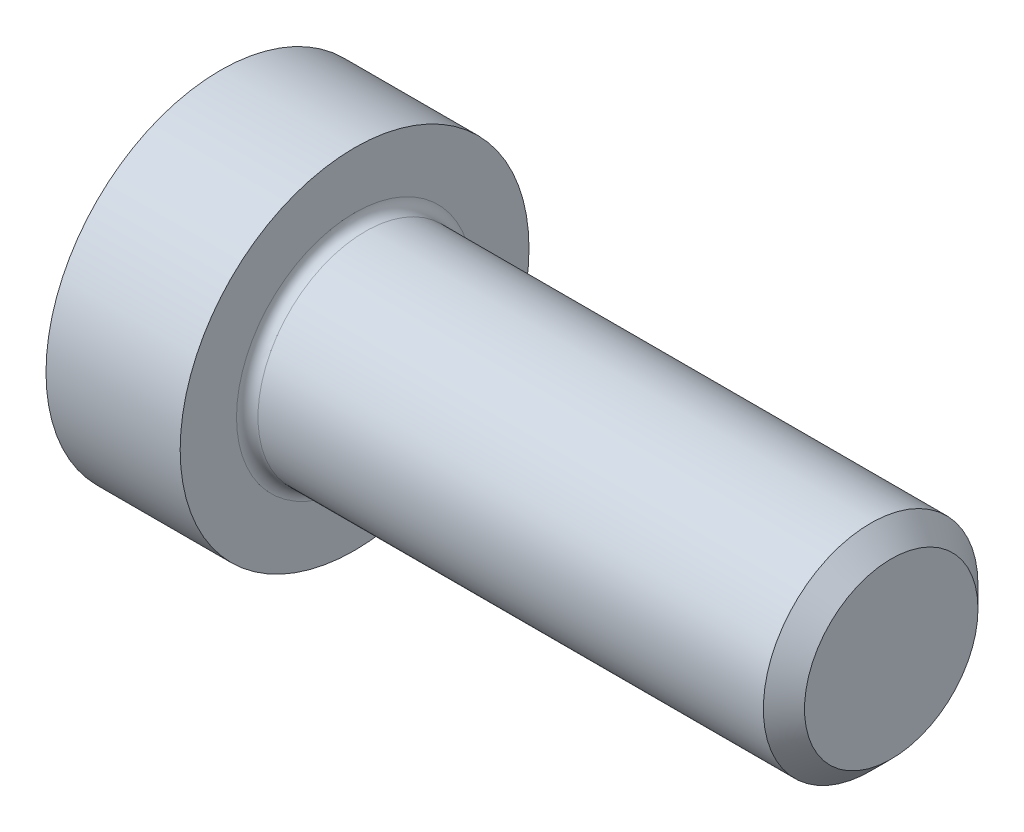
ISO-10303-21;
HEADER;
FILE_DESCRIPTION(('STEP AP214'),'2;1');
FILE_NAME('part.step','',(''),(''),'','','');
FILE_SCHEMA(('AUTOMOTIVE_DESIGN { 1 0 10303 214 1 1 1 1 }'));
ENDSEC;
DATA;
#1=APPLICATION_CONTEXT('core data for automotive mechanical design processes');
#2=APPLICATION_PROTOCOL_DEFINITION('international standard','automotive_design',2000,#1);
#3=PRODUCT_CONTEXT('',#1,'mechanical');
#4=PRODUCT('Part','Part','',(#3));
#5=PRODUCT_RELATED_PRODUCT_CATEGORY('part','',(#4));
#6=PRODUCT_DEFINITION_FORMATION('','',#4);
#7=PRODUCT_DEFINITION_CONTEXT('part definition',#1,'design');
#8=PRODUCT_DEFINITION('design','',#6,#7);
#9=PRODUCT_DEFINITION_SHAPE('','',#8);
#10=(LENGTH_UNIT() NAMED_UNIT(*) SI_UNIT(.MILLI.,.METRE.));
#11=(NAMED_UNIT(*) PLANE_ANGLE_UNIT() SI_UNIT($,.RADIAN.));
#12=(NAMED_UNIT(*) SI_UNIT($,.STERADIAN.) SOLID_ANGLE_UNIT());
#13=UNCERTAINTY_MEASURE_WITH_UNIT(LENGTH_MEASURE(1.E-05),#10,'distance_accuracy_value','');
#14=(GEOMETRIC_REPRESENTATION_CONTEXT(3) GLOBAL_UNCERTAINTY_ASSIGNED_CONTEXT((#13)) GLOBAL_UNIT_ASSIGNED_CONTEXT((#10,
#11,#12)) REPRESENTATION_CONTEXT('',''));
#15=CARTESIAN_POINT('',(0.,0.,0.));
#16=DIRECTION('',(0.,0.,1.));
#17=DIRECTION('',(1.,0.,0.));
#18=AXIS2_PLACEMENT_3D('',#15,#16,#17);
#19=CARTESIAN_POINT('',(-5.,0.,0.));
#20=DIRECTION('',(1.,0.,0.));
#21=DIRECTION('',(0.,0.,-1.));
#22=AXIS2_PLACEMENT_3D('',#19,#20,#21);
#23=PLANE('',#22);
#24=CARTESIAN_POINT('',(-5.,0.,0.));
#25=DIRECTION('',(1.,0.,0.));
#26=DIRECTION('',(0.,0.,-1.));
#27=AXIS2_PLACEMENT_3D('',#24,#25,#26);
#28=CIRCLE('',#27,6.5);
#29=CARTESIAN_POINT('',(-5.,0.,-6.5));
#30=VERTEX_POINT('',#29);
#31=EDGE_CURVE('E11',#30,#30,#28,.T.);
#32=ORIENTED_EDGE('',*,*,#31,.F.);
#33=EDGE_LOOP('',(#32));
#34=FACE_BOUND('',#33,.T.);
#35=DIRECTION('',(0.,0.5,-0.866025403784439));
#36=VECTOR('',#35,1.);
#37=CARTESIAN_POINT('',(-5.,-2.88675134594813,0.));
#38=LINE('',#37,#36);
#39=CARTESIAN_POINT('',(-5.,-2.88675134594813,0.));
#40=VERTEX_POINT('',#39);
#41=CARTESIAN_POINT('',(-5.,-1.44337567297406,-2.5));
#42=VERTEX_POINT('',#41);
#43=EDGE_CURVE('E152',#40,#42,#38,.T.);
#44=ORIENTED_EDGE('',*,*,#43,.T.);
#45=DIRECTION('',(0.,1.,0.));
#46=VECTOR('',#45,1.);
#47=CARTESIAN_POINT('',(-5.,-1.44337567297406,-2.5));
#48=LINE('',#47,#46);
#49=CARTESIAN_POINT('',(-5.,1.44337567297406,-2.5));
#50=VERTEX_POINT('',#49);
#51=EDGE_CURVE('E154',#42,#50,#48,.T.);
#52=ORIENTED_EDGE('',*,*,#51,.T.);
#53=DIRECTION('',(0.,0.5,0.866025403784439));
#54=VECTOR('',#53,1.);
#55=CARTESIAN_POINT('',(-5.,1.44337567297406,-2.5));
#56=LINE('',#55,#54);
#57=CARTESIAN_POINT('',(-5.,2.88675134594813,0.));
#58=VERTEX_POINT('',#57);
#59=EDGE_CURVE('E157',#50,#58,#56,.T.);
#60=ORIENTED_EDGE('',*,*,#59,.T.);
#61=DIRECTION('',(0.,-0.5,0.866025403784439));
#62=VECTOR('',#61,1.);
#63=CARTESIAN_POINT('',(-5.,2.88675134594813,0.));
#64=LINE('',#63,#62);
#65=CARTESIAN_POINT('',(-5.,1.44337567297406,2.5));
#66=VERTEX_POINT('',#65);
#67=EDGE_CURVE('E99',#58,#66,#64,.T.);
#68=ORIENTED_EDGE('',*,*,#67,.T.);
#69=DIRECTION('',(0.,-1.,0.));
#70=VECTOR('',#69,1.);
#71=CARTESIAN_POINT('',(-5.,1.44337567297406,2.5));
#72=LINE('',#71,#70);
#73=CARTESIAN_POINT('',(-5.,-1.44337567297406,2.5));
#74=VERTEX_POINT('',#73);
#75=EDGE_CURVE('E159',#66,#74,#72,.T.);
#76=ORIENTED_EDGE('',*,*,#75,.T.);
#77=DIRECTION('',(0.,-0.5,-0.866025403784439));
#78=VECTOR('',#77,1.);
#79=CARTESIAN_POINT('',(-5.,-1.44337567297406,2.5));
#80=LINE('',#79,#78);
#81=EDGE_CURVE('E114',#74,#40,#80,.T.);
#82=ORIENTED_EDGE('',*,*,#81,.T.);
#83=EDGE_LOOP('',(#44,#52,#60,#68,#76,#82));
#84=FACE_BOUND('',#83,.T.);
#85=ADVANCED_FACE('F16',(#34,#84),#23,.F.);
#86=CARTESIAN_POINT('',(20.,0.,0.));
#87=DIRECTION('',(1.,0.,0.));
#88=DIRECTION('',(0.,0.,-1.));
#89=AXIS2_PLACEMENT_3D('',#86,#87,#88);
#90=CYLINDRICAL_SURFACE('',#89,6.5);
#91=CARTESIAN_POINT('',(0.,0.,0.));
#92=DIRECTION('',(1.,0.,0.));
#93=DIRECTION('',(0.,0.,-1.));
#94=AXIS2_PLACEMENT_3D('',#91,#92,#93);
#95=CIRCLE('',#94,6.5);
#96=CARTESIAN_POINT('',(0.,0.,-6.5));
#97=VERTEX_POINT('',#96);
#98=EDGE_CURVE('E23',#97,#97,#95,.T.);
#99=ORIENTED_EDGE('',*,*,#98,.F.);
#100=EDGE_LOOP('',(#99));
#101=FACE_BOUND('',#100,.T.);
#102=ORIENTED_EDGE('',*,*,#31,.T.);
#103=EDGE_LOOP('',(#102));
#104=FACE_BOUND('',#103,.T.);
#105=ADVANCED_FACE('F143',(#101,#104),#90,.T.);
#106=CARTESIAN_POINT('',(0.,6.5,0.));
#107=DIRECTION('',(-1.,0.,0.));
#108=DIRECTION('',(0.,0.,1.));
#109=AXIS2_PLACEMENT_3D('',#106,#107,#108);
#110=PLANE('',#109);
#111=CARTESIAN_POINT('',(0.,0.,0.));
#112=DIRECTION('',(1.,0.,0.));
#113=DIRECTION('',(0.,0.,-1.));
#114=AXIS2_PLACEMENT_3D('',#111,#112,#113);
#115=CIRCLE('',#114,4.4);
#116=CARTESIAN_POINT('',(0.,0.,-4.4));
#117=VERTEX_POINT('',#116);
#118=EDGE_CURVE('E136',#117,#117,#115,.T.);
#119=ORIENTED_EDGE('',*,*,#118,.F.);
#120=EDGE_LOOP('',(#119));
#121=FACE_BOUND('',#120,.T.);
#122=ORIENTED_EDGE('',*,*,#98,.T.);
#123=EDGE_LOOP('',(#122));
#124=FACE_BOUND('',#123,.T.);
#125=ADVANCED_FACE('F141',(#121,#124),#110,.F.);
#126=CARTESIAN_POINT('',(0.399999999999999,0.,0.));
#127=DIRECTION('',(1.,0.,0.));
#128=DIRECTION('',(0.,0.,-1.));
#129=AXIS2_PLACEMENT_3D('',#126,#127,#128);
#130=TOROIDAL_SURFACE('',#129,4.4,0.399999999999999);
#131=CARTESIAN_POINT('',(0.400000000000001,0.,0.));
#132=DIRECTION('',(1.,0.,0.));
#133=DIRECTION('',(0.,0.,-1.));
#134=AXIS2_PLACEMENT_3D('',#131,#132,#133);
#135=CIRCLE('',#134,4.);
#136=CARTESIAN_POINT('',(0.400000000000001,0.,-4.));
#137=VERTEX_POINT('',#136);
#138=EDGE_CURVE('E133',#137,#137,#135,.T.);
#139=ORIENTED_EDGE('',*,*,#138,.F.);
#140=EDGE_LOOP('',(#139));
#141=FACE_BOUND('',#140,.T.);
#142=ORIENTED_EDGE('',*,*,#118,.T.);
#143=EDGE_LOOP('',(#142));
#144=FACE_BOUND('',#143,.T.);
#145=ADVANCED_FACE('F250',(#141,#144),#130,.F.);
#146=CARTESIAN_POINT('',(20.,0.,0.));
#147=DIRECTION('',(1.,0.,0.));
#148=DIRECTION('',(0.,0.,-1.));
#149=AXIS2_PLACEMENT_3D('',#146,#147,#148);
#150=CYLINDRICAL_SURFACE('',#149,4.);
#151=CARTESIAN_POINT('',(19.233,0.,0.));
#152=DIRECTION('',(1.,0.,0.));
#153=DIRECTION('',(0.,0.,-1.));
#154=AXIS2_PLACEMENT_3D('',#151,#152,#153);
#155=CIRCLE('',#154,4.);
#156=CARTESIAN_POINT('',(19.233,0.,-4.));
#157=VERTEX_POINT('',#156);
#158=EDGE_CURVE('E130',#157,#157,#155,.T.);
#159=ORIENTED_EDGE('',*,*,#158,.F.);
#160=EDGE_LOOP('',(#159));
#161=FACE_BOUND('',#160,.T.);
#162=ORIENTED_EDGE('',*,*,#138,.T.);
#163=EDGE_LOOP('',(#162));
#164=FACE_BOUND('',#163,.T.);
#165=ADVANCED_FACE('F246',(#161,#164),#150,.T.);
#166=CARTESIAN_POINT('',(19.233,0.,0.));
#167=DIRECTION('',(-1.,0.,0.));
#168=DIRECTION('',(0.,0.,1.));
#169=AXIS2_PLACEMENT_3D('',#166,#167,#168);
#170=CONICAL_SURFACE('',#169,4.,0.785398163397448);
#171=CARTESIAN_POINT('',(20.,0.,0.));
#172=DIRECTION('',(1.,0.,0.));
#173=DIRECTION('',(0.,0.,-1.));
#174=AXIS2_PLACEMENT_3D('',#171,#172,#173);
#175=CIRCLE('',#174,3.233);
#176=CARTESIAN_POINT('',(20.,0.,-3.233));
#177=VERTEX_POINT('',#176);
#178=EDGE_CURVE('E126',#177,#177,#175,.T.);
#179=ORIENTED_EDGE('',*,*,#178,.F.);
#180=EDGE_LOOP('',(#179));
#181=FACE_BOUND('',#180,.T.);
#182=ORIENTED_EDGE('',*,*,#158,.T.);
#183=EDGE_LOOP('',(#182));
#184=FACE_BOUND('',#183,.T.);
#185=ADVANCED_FACE('F242',(#181,#184),#170,.T.);
#186=CARTESIAN_POINT('',(20.,3.233,0.));
#187=DIRECTION('',(-1.,0.,0.));
#188=DIRECTION('',(0.,0.,1.));
#189=AXIS2_PLACEMENT_3D('',#186,#187,#188);
#190=PLANE('',#189);
#191=ORIENTED_EDGE('',*,*,#178,.T.);
#192=EDGE_LOOP('',(#191));
#193=FACE_BOUND('',#192,.T.);
#194=ADVANCED_FACE('F237',(#193),#190,.F.);
#195=CARTESIAN_POINT('',(-1.2,1.44337567297406,2.5));
#196=DIRECTION('',(0.,0.,-1.));
#197=DIRECTION('',(-1.,0.,0.));
#198=AXIS2_PLACEMENT_3D('',#195,#196,#197);
#199=PLANE('',#198);
#200=ORIENTED_EDGE('',*,*,#75,.F.);
#201=DIRECTION('',(-1.,0.,0.));
#202=VECTOR('',#201,1.);
#203=CARTESIAN_POINT('',(-1.2,1.44337567297406,2.5));
#204=LINE('',#203,#202);
#205=CARTESIAN_POINT('',(-1.2,1.44337567297406,2.5));
#206=VERTEX_POINT('',#205);
#207=EDGE_CURVE('E166',#206,#66,#204,.T.);
#208=ORIENTED_EDGE('',*,*,#207,.F.);
#209=DIRECTION('',(0.,-1.,0.));
#210=VECTOR('',#209,1.);
#211=CARTESIAN_POINT('',(-1.2,1.44337567297406,2.5));
#212=LINE('',#211,#210);
#213=CARTESIAN_POINT('',(-1.2,0.,2.5));
#214=VERTEX_POINT('',#213);
#215=EDGE_CURVE('E96',#206,#214,#212,.T.);
#216=ORIENTED_EDGE('',*,*,#215,.T.);
#217=CARTESIAN_POINT('',(-1.2,-1.44337567297406,2.5));
#218=VERTEX_POINT('',#217);
#219=EDGE_CURVE('E88',#214,#218,#212,.T.);
#220=ORIENTED_EDGE('',*,*,#219,.T.);
#221=DIRECTION('',(-1.,0.,0.));
#222=VECTOR('',#221,1.);
#223=CARTESIAN_POINT('',(-1.2,-1.44337567297406,2.5));
#224=LINE('',#223,#222);
#225=EDGE_CURVE('E92',#218,#74,#224,.T.);
#226=ORIENTED_EDGE('',*,*,#225,.T.);
#227=EDGE_LOOP('',(#200,#208,#216,#220,#226));
#228=FACE_BOUND('',#227,.T.);
#229=ADVANCED_FACE('F90',(#228),#199,.T.);
#230=CARTESIAN_POINT('',(-1.2,-1.44337567297406,2.5));
#231=DIRECTION('',(0.,0.866025403784439,-0.5));
#232=DIRECTION('',(0.,0.5,0.866025403784439));
#233=AXIS2_PLACEMENT_3D('',#230,#231,#232);
#234=PLANE('',#233);
#235=ORIENTED_EDGE('',*,*,#81,.F.);
#236=ORIENTED_EDGE('',*,*,#225,.F.);
#237=DIRECTION('',(0.,-0.5,-0.866025403784439));
#238=VECTOR('',#237,1.);
#239=CARTESIAN_POINT('',(-1.2,-1.44337567297406,2.5));
#240=LINE('',#239,#238);
#241=CARTESIAN_POINT('',(-1.2,-2.1650635094611,1.25));
#242=VERTEX_POINT('',#241);
#243=EDGE_CURVE('E102',#218,#242,#240,.T.);
#244=ORIENTED_EDGE('',*,*,#243,.T.);
#245=CARTESIAN_POINT('',(-1.2,-2.88675134594813,0.));
#246=VERTEX_POINT('',#245);
#247=EDGE_CURVE('E109',#242,#246,#240,.T.);
#248=ORIENTED_EDGE('',*,*,#247,.T.);
#249=DIRECTION('',(-1.,0.,0.));
#250=VECTOR('',#249,1.);
#251=CARTESIAN_POINT('',(-1.2,-2.88675134594813,0.));
#252=LINE('',#251,#250);
#253=EDGE_CURVE('E116',#246,#40,#252,.T.);
#254=ORIENTED_EDGE('',*,*,#253,.T.);
#255=EDGE_LOOP('',(#235,#236,#244,#248,#254));
#256=FACE_BOUND('',#255,.T.);
#257=ADVANCED_FACE('F111',(#256),#234,.T.);
#258=CARTESIAN_POINT('',(-1.2,-2.88675134594813,0.));
#259=DIRECTION('',(0.,0.866025403784439,0.5));
#260=DIRECTION('',(0.,-0.5,0.866025403784439));
#261=AXIS2_PLACEMENT_3D('',#258,#259,#260);
#262=PLANE('',#261);
#263=ORIENTED_EDGE('',*,*,#43,.F.);
#264=ORIENTED_EDGE('',*,*,#253,.F.);
#265=DIRECTION('',(0.,0.5,-0.866025403784439));
#266=VECTOR('',#265,1.);
#267=CARTESIAN_POINT('',(-1.2,-2.88675134594813,0.));
#268=LINE('',#267,#266);
#269=CARTESIAN_POINT('',(-1.2,-2.1650635094611,-1.25));
#270=VERTEX_POINT('',#269);
#271=EDGE_CURVE('E30',#246,#270,#268,.T.);
#272=ORIENTED_EDGE('',*,*,#271,.T.);
#273=CARTESIAN_POINT('',(-1.2,-1.44337567297406,-2.5));
#274=VERTEX_POINT('',#273);
#275=EDGE_CURVE('E108',#270,#274,#268,.T.);
#276=ORIENTED_EDGE('',*,*,#275,.T.);
#277=DIRECTION('',(-1.,0.,0.));
#278=VECTOR('',#277,1.);
#279=CARTESIAN_POINT('',(-1.2,-1.44337567297406,-2.5));
#280=LINE('',#279,#278);
#281=EDGE_CURVE('E122',#274,#42,#280,.T.);
#282=ORIENTED_EDGE('',*,*,#281,.T.);
#283=EDGE_LOOP('',(#263,#264,#272,#276,#282));
#284=FACE_BOUND('',#283,.T.);
#285=ADVANCED_FACE('F176',(#284),#262,.T.);
#286=CARTESIAN_POINT('',(-1.2,-1.44337567297406,-2.5));
#287=DIRECTION('',(0.,0.,1.));
#288=DIRECTION('',(1.,0.,0.));
#289=AXIS2_PLACEMENT_3D('',#286,#287,#288);
#290=PLANE('',#289);
#291=ORIENTED_EDGE('',*,*,#51,.F.);
#292=ORIENTED_EDGE('',*,*,#281,.F.);
#293=DIRECTION('',(0.,1.,0.));
#294=VECTOR('',#293,1.);
#295=CARTESIAN_POINT('',(-1.2,-1.44337567297406,-2.5));
#296=LINE('',#295,#294);
#297=CARTESIAN_POINT('',(-1.2,0.,-2.5));
#298=VERTEX_POINT('',#297);
#299=EDGE_CURVE('E181',#274,#298,#296,.T.);
#300=ORIENTED_EDGE('',*,*,#299,.T.);
#301=CARTESIAN_POINT('',(-1.2,1.44337567297406,-2.5));
#302=VERTEX_POINT('',#301);
#303=EDGE_CURVE('E189',#298,#302,#296,.T.);
#304=ORIENTED_EDGE('',*,*,#303,.T.);
#305=DIRECTION('',(-1.,0.,0.));
#306=VECTOR('',#305,1.);
#307=CARTESIAN_POINT('',(-1.2,1.44337567297406,-2.5));
#308=LINE('',#307,#306);
#309=EDGE_CURVE('E173',#302,#50,#308,.T.);
#310=ORIENTED_EDGE('',*,*,#309,.T.);
#311=EDGE_LOOP('',(#291,#292,#300,#304,#310));
#312=FACE_BOUND('',#311,.T.);
#313=ADVANCED_FACE('F180',(#312),#290,.T.);
#314=CARTESIAN_POINT('',(-1.2,1.44337567297406,-2.5));
#315=DIRECTION('',(0.,-0.866025403784439,0.5));
#316=DIRECTION('',(0.,-0.5,-0.866025403784439));
#317=AXIS2_PLACEMENT_3D('',#314,#315,#316);
#318=PLANE('',#317);
#319=ORIENTED_EDGE('',*,*,#59,.F.);
#320=ORIENTED_EDGE('',*,*,#309,.F.);
#321=DIRECTION('',(0.,0.5,0.866025403784439));
#322=VECTOR('',#321,1.);
#323=CARTESIAN_POINT('',(-1.2,1.44337567297406,-2.5));
#324=LINE('',#323,#322);
#325=CARTESIAN_POINT('',(-1.2,2.1650635094611,-1.25));
#326=VERTEX_POINT('',#325);
#327=EDGE_CURVE('E191',#302,#326,#324,.T.);
#328=ORIENTED_EDGE('',*,*,#327,.T.);
#329=CARTESIAN_POINT('',(-1.2,2.88675134594813,0.));
#330=VERTEX_POINT('',#329);
#331=EDGE_CURVE('E188',#326,#330,#324,.T.);
#332=ORIENTED_EDGE('',*,*,#331,.T.);
#333=DIRECTION('',(-1.,0.,0.));
#334=VECTOR('',#333,1.);
#335=CARTESIAN_POINT('',(-1.2,2.88675134594813,0.));
#336=LINE('',#335,#334);
#337=EDGE_CURVE('E169',#330,#58,#336,.T.);
#338=ORIENTED_EDGE('',*,*,#337,.T.);
#339=EDGE_LOOP('',(#319,#320,#328,#332,#338));
#340=FACE_BOUND('',#339,.T.);
#341=ADVANCED_FACE('F219',(#340),#318,.T.);
#342=CARTESIAN_POINT('',(-1.2,2.88675134594813,0.));
#343=DIRECTION('',(0.,-0.866025403784439,-0.5));
#344=DIRECTION('',(0.,0.5,-0.866025403784439));
#345=AXIS2_PLACEMENT_3D('',#342,#343,#344);
#346=PLANE('',#345);
#347=ORIENTED_EDGE('',*,*,#67,.F.);
#348=ORIENTED_EDGE('',*,*,#337,.F.);
#349=DIRECTION('',(0.,-0.5,0.866025403784439));
#350=VECTOR('',#349,1.);
#351=CARTESIAN_POINT('',(-1.2,2.88675134594813,0.));
#352=LINE('',#351,#350);
#353=CARTESIAN_POINT('',(-1.2,2.1650635094611,1.25));
#354=VERTEX_POINT('',#353);
#355=EDGE_CURVE('E170',#330,#354,#352,.T.);
#356=ORIENTED_EDGE('',*,*,#355,.T.);
#357=EDGE_CURVE('E196',#354,#206,#352,.T.);
#358=ORIENTED_EDGE('',*,*,#357,.T.);
#359=ORIENTED_EDGE('',*,*,#207,.T.);
#360=EDGE_LOOP('',(#347,#348,#356,#358,#359));
#361=FACE_BOUND('',#360,.T.);
#362=ADVANCED_FACE('F199',(#361),#346,.T.);
#363=CARTESIAN_POINT('',(-1.2,0.,0.));
#364=DIRECTION('',(1.,0.,0.));
#365=DIRECTION('',(0.,0.,-1.));
#366=AXIS2_PLACEMENT_3D('',#363,#364,#365);
#367=PLANE('',#366);
#368=CARTESIAN_POINT('',(-1.2,0.,0.));
#369=DIRECTION('',(1.,0.,0.));
#370=DIRECTION('',(0.,0.,-1.));
#371=AXIS2_PLACEMENT_3D('',#368,#369,#370);
#372=CIRCLE('',#371,2.5);
#373=EDGE_CURVE('E115',#298,#326,#372,.T.);
#374=ORIENTED_EDGE('',*,*,#373,.T.);
#375=ORIENTED_EDGE('',*,*,#327,.F.);
#376=ORIENTED_EDGE('',*,*,#303,.F.);
#377=EDGE_LOOP('',(#374,#375,#376));
#378=FACE_BOUND('',#377,.T.);
#379=ADVANCED_FACE('F214',(#378),#367,.F.);
#380=ORIENTED_EDGE('',*,*,#331,.F.);
#381=EDGE_CURVE('E121',#326,#354,#372,.T.);
#382=ORIENTED_EDGE('',*,*,#381,.T.);
#383=ORIENTED_EDGE('',*,*,#355,.F.);
#384=EDGE_LOOP('',(#380,#382,#383));
#385=FACE_BOUND('',#384,.T.);
#386=ADVANCED_FACE('F216',(#385),#367,.F.);
#387=EDGE_CURVE('E127',#354,#214,#372,.T.);
#388=ORIENTED_EDGE('',*,*,#387,.T.);
#389=ORIENTED_EDGE('',*,*,#215,.F.);
#390=ORIENTED_EDGE('',*,*,#357,.F.);
#391=EDGE_LOOP('',(#388,#389,#390));
#392=FACE_BOUND('',#391,.T.);
#393=ADVANCED_FACE('F205',(#392),#367,.F.);
#394=EDGE_CURVE('E104',#214,#242,#372,.T.);
#395=ORIENTED_EDGE('',*,*,#394,.T.);
#396=ORIENTED_EDGE('',*,*,#243,.F.);
#397=ORIENTED_EDGE('',*,*,#219,.F.);
#398=EDGE_LOOP('',(#395,#396,#397));
#399=FACE_BOUND('',#398,.T.);
#400=ADVANCED_FACE('F103',(#399),#367,.F.);
#401=EDGE_CURVE('E208',#242,#270,#372,.T.);
#402=ORIENTED_EDGE('',*,*,#401,.T.);
#403=ORIENTED_EDGE('',*,*,#271,.F.);
#404=ORIENTED_EDGE('',*,*,#247,.F.);
#405=EDGE_LOOP('',(#402,#403,#404));
#406=FACE_BOUND('',#405,.T.);
#407=ADVANCED_FACE('F207',(#406),#367,.F.);
#408=EDGE_CURVE('E119',#270,#298,#372,.T.);
#409=ORIENTED_EDGE('',*,*,#408,.T.);
#410=ORIENTED_EDGE('',*,*,#299,.F.);
#411=ORIENTED_EDGE('',*,*,#275,.F.);
#412=EDGE_LOOP('',(#409,#410,#411));
#413=FACE_BOUND('',#412,.T.);
#414=ADVANCED_FACE('F184',(#413),#367,.F.);
#415=CARTESIAN_POINT('',(-1.2,0.,0.));
#416=DIRECTION('',(-1.,0.,0.));
#417=DIRECTION('',(0.,0.,1.));
#418=AXIS2_PLACEMENT_3D('',#415,#416,#417);
#419=CONICAL_SURFACE('',#418,2.5,1.22173047639603);
#420=CARTESIAN_POINT('',(-0.290074414334494,0.,0.));
#421=VERTEX_POINT('',#420);
#422=VERTEX_LOOP('',#421);
#423=FACE_BOUND('',#422,.T.);
#424=ORIENTED_EDGE('',*,*,#381,.F.);
#425=ORIENTED_EDGE('',*,*,#373,.F.);
#426=ORIENTED_EDGE('',*,*,#408,.F.);
#427=ORIENTED_EDGE('',*,*,#401,.F.);
#428=ORIENTED_EDGE('',*,*,#394,.F.);
#429=ORIENTED_EDGE('',*,*,#387,.F.);
#430=EDGE_LOOP('',(#424,#425,#426,#427,#428,#429));
#431=FACE_BOUND('',#430,.T.);
#432=ADVANCED_FACE('F210',(#423,#431),#419,.F.);
#433=CLOSED_SHELL('',(#85,#105,#125,#145,#165,#185,#194,#229,#257,#285,#313,#341,#362,#379,#386,
#393,#400,#407,#414,#432));
#434=MANIFOLD_SOLID_BREP('B1',#433);
#435=ADVANCED_BREP_SHAPE_REPRESENTATION('',(#18,#434),#14);
#436=SHAPE_DEFINITION_REPRESENTATION(#9,#435);
ENDSEC;
END-ISO-10303-21;
